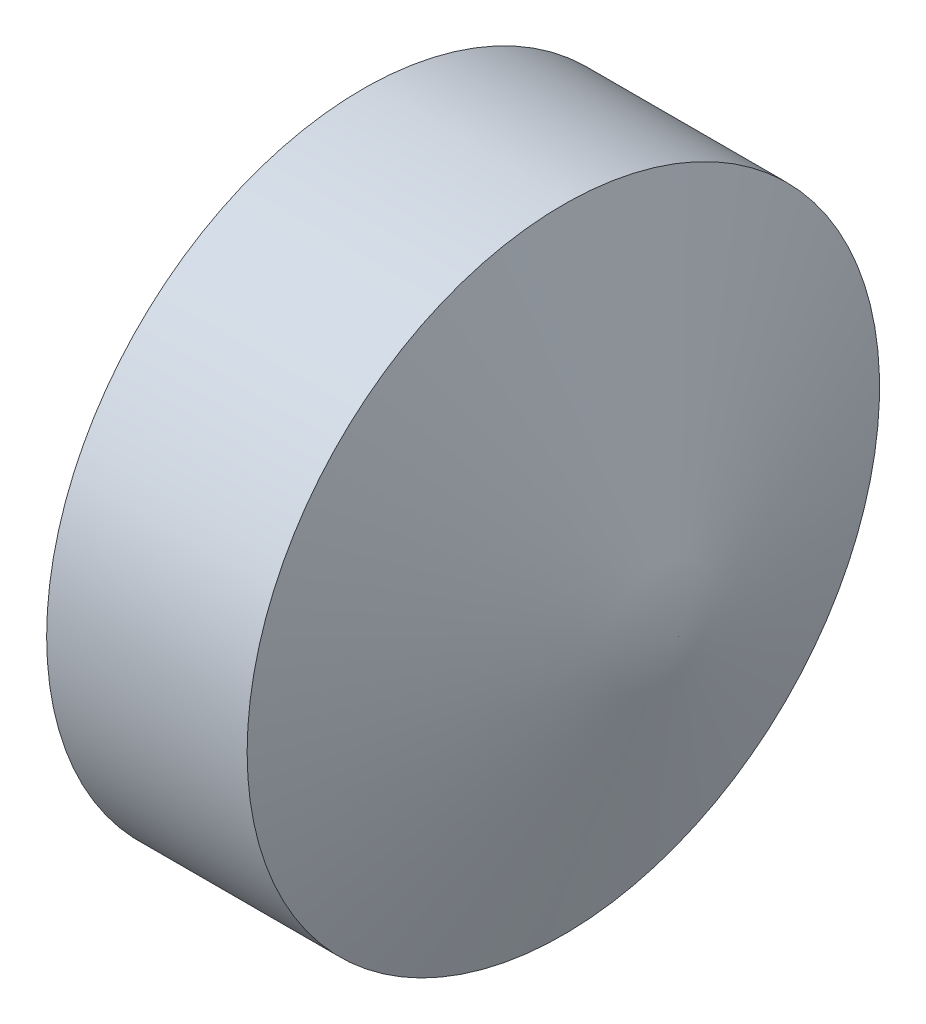
ISO-10303-21;
HEADER;
FILE_DESCRIPTION(('STEP AP214'),'2;1');
FILE_NAME('part.step','',(''),(''),'','','');
FILE_SCHEMA(('AUTOMOTIVE_DESIGN { 1 0 10303 214 1 1 1 1 }'));
ENDSEC;
DATA;
#1=APPLICATION_CONTEXT('core data for automotive mechanical design processes');
#2=APPLICATION_PROTOCOL_DEFINITION('international standard','automotive_design',2000,#1);
#3=PRODUCT_CONTEXT('',#1,'mechanical');
#4=PRODUCT('Part','Part','',(#3));
#5=PRODUCT_RELATED_PRODUCT_CATEGORY('part','',(#4));
#6=PRODUCT_DEFINITION_FORMATION('','',#4);
#7=PRODUCT_DEFINITION_CONTEXT('part definition',#1,'design');
#8=PRODUCT_DEFINITION('design','',#6,#7);
#9=PRODUCT_DEFINITION_SHAPE('','',#8);
#10=(LENGTH_UNIT() NAMED_UNIT(*) SI_UNIT(.MILLI.,.METRE.));
#11=(NAMED_UNIT(*) PLANE_ANGLE_UNIT() SI_UNIT($,.RADIAN.));
#12=(NAMED_UNIT(*) SI_UNIT($,.STERADIAN.) SOLID_ANGLE_UNIT());
#13=UNCERTAINTY_MEASURE_WITH_UNIT(LENGTH_MEASURE(1.E-05),#10,'distance_accuracy_value','');
#14=(GEOMETRIC_REPRESENTATION_CONTEXT(3) GLOBAL_UNCERTAINTY_ASSIGNED_CONTEXT((#13)) GLOBAL_UNIT_ASSIGNED_CONTEXT((#10,
#11,#12)) REPRESENTATION_CONTEXT('',''));
#15=CARTESIAN_POINT('',(0.,0.,0.));
#16=DIRECTION('',(0.,0.,1.));
#17=DIRECTION('',(1.,0.,0.));
#18=AXIS2_PLACEMENT_3D('',#15,#16,#17);
#19=CARTESIAN_POINT('',(3.,0.,0.));
#20=DIRECTION('',(-1.,0.,0.));
#21=DIRECTION('',(0.,0.,1.));
#22=AXIS2_PLACEMENT_3D('',#19,#20,#21);
#23=CYLINDRICAL_SURFACE('',#22,1.35632946891562);
#24=CARTESIAN_POINT('',(1.64635829323957,0.,0.));
#25=DIRECTION('',(-1.,0.,0.));
#26=DIRECTION('',(0.,0.,1.));
#27=AXIS2_PLACEMENT_3D('',#24,#25,#26);
#28=CIRCLE('',#27,1.35632946891562);
#29=CARTESIAN_POINT('',(1.64635829323957,0.,1.35632946891562));
#30=VERTEX_POINT('',#29);
#31=EDGE_CURVE('E11',#30,#30,#28,.F.);
#32=ORIENTED_EDGE('',*,*,#31,.T.);
#33=EDGE_LOOP('',(#32));
#34=FACE_BOUND('',#33,.T.);
#35=CARTESIAN_POINT('',(2.50633644545662,0.,0.));
#36=DIRECTION('',(-1.,0.,0.));
#37=DIRECTION('',(0.,0.,1.));
#38=AXIS2_PLACEMENT_3D('',#35,#36,#37);
#39=CIRCLE('',#38,1.35632946891562);
#40=CARTESIAN_POINT('',(2.50633644545662,0.,1.35632946891562));
#41=VERTEX_POINT('',#40);
#42=EDGE_CURVE('E137',#41,#41,#39,.T.);
#43=ORIENTED_EDGE('',*,*,#42,.T.);
#44=EDGE_LOOP('',(#43));
#45=FACE_BOUND('',#44,.T.);
#46=ADVANCED_FACE('F37',(#34,#45),#23,.T.);
#47=CARTESIAN_POINT('',(1.5,0.,0.));
#48=DIRECTION('',(-1.,0.,0.));
#49=DIRECTION('',(0.,0.,1.));
#50=AXIS2_PLACEMENT_3D('',#47,#48,#49);
#51=PLANE('',#50);
#52=CARTESIAN_POINT('',(1.5,0.,0.));
#53=DIRECTION('',(-1.,0.,0.));
#54=DIRECTION('',(0.,0.,1.));
#55=AXIS2_PLACEMENT_3D('',#52,#53,#54);
#56=CIRCLE('',#55,1.10282946891562);
#57=CARTESIAN_POINT('',(1.5,0.,1.10282946891562));
#58=VERTEX_POINT('',#57);
#59=EDGE_CURVE('E45',#58,#58,#56,.T.);
#60=ORIENTED_EDGE('',*,*,#59,.T.);
#61=EDGE_LOOP('',(#60));
#62=FACE_BOUND('',#61,.T.);
#63=DIRECTION('',(0.,0.,1.));
#64=VECTOR('',#63,1.);
#65=CARTESIAN_POINT('',(1.5,-0.65,-0.375277674973259));
#66=LINE('',#65,#64);
#67=CARTESIAN_POINT('',(1.5,-0.65,-0.375277674973259));
#68=VERTEX_POINT('',#67);
#69=CARTESIAN_POINT('',(1.5,-0.65,0.375277674973254));
#70=VERTEX_POINT('',#69);
#71=EDGE_CURVE('E52',#68,#70,#66,.T.);
#72=ORIENTED_EDGE('',*,*,#71,.F.);
#73=DIRECTION('',(0.,-0.866025403784439,0.499999999999999));
#74=VECTOR('',#73,1.);
#75=CARTESIAN_POINT('',(1.5,0.,-0.750555349946517));
#76=LINE('',#75,#74);
#77=CARTESIAN_POINT('',(1.5,0.,-0.750555349946517));
#78=VERTEX_POINT('',#77);
#79=EDGE_CURVE('E111',#78,#68,#76,.T.);
#80=ORIENTED_EDGE('',*,*,#79,.F.);
#81=DIRECTION('',(0.,-0.866025403784437,-0.500000000000002));
#82=VECTOR('',#81,1.);
#83=CARTESIAN_POINT('',(1.5,0.65,-0.37527767497326));
#84=LINE('',#83,#82);
#85=CARTESIAN_POINT('',(1.5,0.65,-0.37527767497326));
#86=VERTEX_POINT('',#85);
#87=EDGE_CURVE('E114',#86,#78,#84,.T.);
#88=ORIENTED_EDGE('',*,*,#87,.F.);
#89=DIRECTION('',(0.,0.,-1.));
#90=VECTOR('',#89,1.);
#91=CARTESIAN_POINT('',(1.5,0.65,0.375277674973253));
#92=LINE('',#91,#90);
#93=CARTESIAN_POINT('',(1.5,0.65,0.375277674973253));
#94=VERTEX_POINT('',#93);
#95=EDGE_CURVE('E130',#94,#86,#92,.T.);
#96=ORIENTED_EDGE('',*,*,#95,.F.);
#97=DIRECTION('',(0.,0.866025403784437,-0.500000000000002));
#98=VECTOR('',#97,1.);
#99=CARTESIAN_POINT('',(1.5,0.,0.75055534994651));
#100=LINE('',#99,#98);
#101=CARTESIAN_POINT('',(1.5,0.,0.75055534994651));
#102=VERTEX_POINT('',#101);
#103=EDGE_CURVE('E127',#102,#94,#100,.T.);
#104=ORIENTED_EDGE('',*,*,#103,.F.);
#105=DIRECTION('',(0.,0.86602540378444,0.499999999999997));
#106=VECTOR('',#105,1.);
#107=CARTESIAN_POINT('',(1.5,-0.65,0.375277674973254));
#108=LINE('',#107,#106);
#109=EDGE_CURVE('E125',#70,#102,#108,.T.);
#110=ORIENTED_EDGE('',*,*,#109,.F.);
#111=EDGE_LOOP('',(#72,#80,#88,#96,#104,#110));
#112=FACE_BOUND('',#111,.T.);
#113=ADVANCED_FACE('F149',(#62,#112),#51,.T.);
#114=CARTESIAN_POINT('',(2.50633644545662,0.,0.));
#115=DIRECTION('',(-1.,0.,0.));
#116=DIRECTION('',(0.,0.,1.));
#117=AXIS2_PLACEMENT_3D('',#114,#115,#116);
#118=CONICAL_SURFACE('',#117,1.35632946891562,1.22173047639603);
#119=CARTESIAN_POINT('',(3.,0.,0.));
#120=VERTEX_POINT('',#119);
#121=VERTEX_LOOP('',#120);
#122=FACE_BOUND('',#121,.T.);
#123=ORIENTED_EDGE('',*,*,#42,.F.);
#124=EDGE_LOOP('',(#123));
#125=FACE_BOUND('',#124,.T.);
#126=ADVANCED_FACE('F164',(#122,#125),#118,.T.);
#127=CARTESIAN_POINT('',(2.7,-0.65,-0.375277674973259));
#128=DIRECTION('',(0.,-1.,0.));
#129=DIRECTION('',(0.,0.,-1.));
#130=AXIS2_PLACEMENT_3D('',#127,#128,#129);
#131=PLANE('',#130);
#132=ORIENTED_EDGE('',*,*,#71,.T.);
#133=DIRECTION('',(-1.,0.,0.));
#134=VECTOR('',#133,1.);
#135=CARTESIAN_POINT('',(2.7,-0.65,0.375277674973254));
#136=LINE('',#135,#134);
#137=CARTESIAN_POINT('',(2.7,-0.65,0.375277674973254));
#138=VERTEX_POINT('',#137);
#139=EDGE_CURVE('E88',#138,#70,#136,.T.);
#140=ORIENTED_EDGE('',*,*,#139,.F.);
#141=DIRECTION('',(0.,0.,1.));
#142=VECTOR('',#141,1.);
#143=CARTESIAN_POINT('',(2.7,-0.65,-0.375277674973259));
#144=LINE('',#143,#142);
#145=CARTESIAN_POINT('',(2.7,-0.65,-0.375277674973259));
#146=VERTEX_POINT('',#145);
#147=EDGE_CURVE('E92',#146,#138,#144,.T.);
#148=ORIENTED_EDGE('',*,*,#147,.F.);
#149=DIRECTION('',(-1.,0.,0.));
#150=VECTOR('',#149,1.);
#151=CARTESIAN_POINT('',(2.7,-0.65,-0.375277674973259));
#152=LINE('',#151,#150);
#153=EDGE_CURVE('E135',#146,#68,#152,.T.);
#154=ORIENTED_EDGE('',*,*,#153,.T.);
#155=EDGE_LOOP('',(#132,#140,#148,#154));
#156=FACE_BOUND('',#155,.T.);
#157=ADVANCED_FACE('F90',(#156),#131,.F.);
#158=CARTESIAN_POINT('',(2.7,0.,-0.750555349946517));
#159=DIRECTION('',(0.,-0.499999999999999,-0.866025403784439));
#160=DIRECTION('',(0.,0.866025403784439,-0.499999999999999));
#161=AXIS2_PLACEMENT_3D('',#158,#159,#160);
#162=PLANE('',#161);
#163=ORIENTED_EDGE('',*,*,#79,.T.);
#164=ORIENTED_EDGE('',*,*,#153,.F.);
#165=DIRECTION('',(0.,-0.866025403784439,0.499999999999999));
#166=VECTOR('',#165,1.);
#167=CARTESIAN_POINT('',(2.7,0.,-0.750555349946517));
#168=LINE('',#167,#166);
#169=CARTESIAN_POINT('',(2.7,0.,-0.750555349946517));
#170=VERTEX_POINT('',#169);
#171=EDGE_CURVE('E98',#170,#146,#168,.T.);
#172=ORIENTED_EDGE('',*,*,#171,.F.);
#173=DIRECTION('',(-1.,0.,0.));
#174=VECTOR('',#173,1.);
#175=CARTESIAN_POINT('',(2.7,0.,-0.750555349946517));
#176=LINE('',#175,#174);
#177=EDGE_CURVE('E138',#170,#78,#176,.T.);
#178=ORIENTED_EDGE('',*,*,#177,.T.);
#179=EDGE_LOOP('',(#163,#164,#172,#178));
#180=FACE_BOUND('',#179,.T.);
#181=ADVANCED_FACE('F172',(#180),#162,.F.);
#182=CARTESIAN_POINT('',(2.7,0.65,-0.37527767497326));
#183=DIRECTION('',(0.,0.500000000000002,-0.866025403784437));
#184=DIRECTION('',(0.,0.866025403784437,0.500000000000002));
#185=AXIS2_PLACEMENT_3D('',#182,#183,#184);
#186=PLANE('',#185);
#187=ORIENTED_EDGE('',*,*,#87,.T.);
#188=ORIENTED_EDGE('',*,*,#177,.F.);
#189=DIRECTION('',(0.,-0.866025403784437,-0.500000000000002));
#190=VECTOR('',#189,1.);
#191=CARTESIAN_POINT('',(2.7,0.65,-0.37527767497326));
#192=LINE('',#191,#190);
#193=CARTESIAN_POINT('',(2.7,0.65,-0.37527767497326));
#194=VERTEX_POINT('',#193);
#195=EDGE_CURVE('E121',#194,#170,#192,.T.);
#196=ORIENTED_EDGE('',*,*,#195,.F.);
#197=DIRECTION('',(-1.,0.,0.));
#198=VECTOR('',#197,1.);
#199=CARTESIAN_POINT('',(2.7,0.65,-0.37527767497326));
#200=LINE('',#199,#198);
#201=EDGE_CURVE('E140',#194,#86,#200,.T.);
#202=ORIENTED_EDGE('',*,*,#201,.T.);
#203=EDGE_LOOP('',(#187,#188,#196,#202));
#204=FACE_BOUND('',#203,.T.);
#205=ADVANCED_FACE('F182',(#204),#186,.F.);
#206=CARTESIAN_POINT('',(2.7,0.65,0.375277674973253));
#207=DIRECTION('',(0.,1.,0.));
#208=DIRECTION('',(0.,0.,1.));
#209=AXIS2_PLACEMENT_3D('',#206,#207,#208);
#210=PLANE('',#209);
#211=ORIENTED_EDGE('',*,*,#95,.T.);
#212=ORIENTED_EDGE('',*,*,#201,.F.);
#213=DIRECTION('',(0.,0.,-1.));
#214=VECTOR('',#213,1.);
#215=CARTESIAN_POINT('',(2.7,0.65,0.375277674973253));
#216=LINE('',#215,#214);
#217=CARTESIAN_POINT('',(2.7,0.65,0.375277674973253));
#218=VERTEX_POINT('',#217);
#219=EDGE_CURVE('E118',#218,#194,#216,.T.);
#220=ORIENTED_EDGE('',*,*,#219,.F.);
#221=DIRECTION('',(-1.,0.,0.));
#222=VECTOR('',#221,1.);
#223=CARTESIAN_POINT('',(2.7,0.65,0.375277674973253));
#224=LINE('',#223,#222);
#225=EDGE_CURVE('E142',#218,#94,#224,.T.);
#226=ORIENTED_EDGE('',*,*,#225,.T.);
#227=EDGE_LOOP('',(#211,#212,#220,#226));
#228=FACE_BOUND('',#227,.T.);
#229=ADVANCED_FACE('F178',(#228),#210,.F.);
#230=CARTESIAN_POINT('',(2.7,0.,0.75055534994651));
#231=DIRECTION('',(0.,0.500000000000002,0.866025403784437));
#232=DIRECTION('',(0.,-0.866025403784438,0.500000000000002));
#233=AXIS2_PLACEMENT_3D('',#230,#231,#232);
#234=PLANE('',#233);
#235=ORIENTED_EDGE('',*,*,#103,.T.);
#236=ORIENTED_EDGE('',*,*,#225,.F.);
#237=DIRECTION('',(0.,0.866025403784437,-0.500000000000002));
#238=VECTOR('',#237,1.);
#239=CARTESIAN_POINT('',(2.7,0.,0.75055534994651));
#240=LINE('',#239,#238);
#241=CARTESIAN_POINT('',(2.7,0.,0.75055534994651));
#242=VERTEX_POINT('',#241);
#243=EDGE_CURVE('E106',#242,#218,#240,.T.);
#244=ORIENTED_EDGE('',*,*,#243,.F.);
#245=DIRECTION('',(-1.,0.,0.));
#246=VECTOR('',#245,1.);
#247=CARTESIAN_POINT('',(2.7,0.,0.75055534994651));
#248=LINE('',#247,#246);
#249=EDGE_CURVE('E97',#242,#102,#248,.T.);
#250=ORIENTED_EDGE('',*,*,#249,.T.);
#251=EDGE_LOOP('',(#235,#236,#244,#250));
#252=FACE_BOUND('',#251,.T.);
#253=ADVANCED_FACE('F175',(#252),#234,.F.);
#254=CARTESIAN_POINT('',(2.7,-0.65,0.375277674973254));
#255=DIRECTION('',(0.,-0.499999999999997,0.86602540378444));
#256=DIRECTION('',(0.,-0.86602540378444,-0.499999999999997));
#257=AXIS2_PLACEMENT_3D('',#254,#255,#256);
#258=PLANE('',#257);
#259=ORIENTED_EDGE('',*,*,#109,.T.);
#260=ORIENTED_EDGE('',*,*,#249,.F.);
#261=DIRECTION('',(0.,0.86602540378444,0.499999999999997));
#262=VECTOR('',#261,1.);
#263=CARTESIAN_POINT('',(2.7,-0.65,0.375277674973254));
#264=LINE('',#263,#262);
#265=EDGE_CURVE('E101',#138,#242,#264,.T.);
#266=ORIENTED_EDGE('',*,*,#265,.F.);
#267=ORIENTED_EDGE('',*,*,#139,.T.);
#268=EDGE_LOOP('',(#259,#260,#266,#267));
#269=FACE_BOUND('',#268,.T.);
#270=ADVANCED_FACE('F102',(#269),#258,.F.);
#271=CARTESIAN_POINT('',(2.7,0.,0.));
#272=DIRECTION('',(-1.,0.,0.));
#273=DIRECTION('',(0.,0.,1.));
#274=AXIS2_PLACEMENT_3D('',#271,#272,#273);
#275=PLANE('',#274);
#276=ORIENTED_EDGE('',*,*,#147,.T.);
#277=ORIENTED_EDGE('',*,*,#265,.T.);
#278=ORIENTED_EDGE('',*,*,#243,.T.);
#279=ORIENTED_EDGE('',*,*,#219,.T.);
#280=ORIENTED_EDGE('',*,*,#195,.T.);
#281=ORIENTED_EDGE('',*,*,#171,.T.);
#282=EDGE_LOOP('',(#276,#277,#278,#279,#280,#281));
#283=FACE_BOUND('',#282,.T.);
#284=ADVANCED_FACE('F108',(#283),#275,.T.);
#285=CARTESIAN_POINT('',(1.5,0.,0.));
#286=DIRECTION('',(1.,0.,0.));
#287=DIRECTION('',(0.,0.,-1.));
#288=AXIS2_PLACEMENT_3D('',#285,#286,#287);
#289=CONICAL_SURFACE('',#288,1.10282946891562,1.0471975511966);
#290=ORIENTED_EDGE('',*,*,#31,.F.);
#291=EDGE_LOOP('',(#290));
#292=FACE_BOUND('',#291,.T.);
#293=ORIENTED_EDGE('',*,*,#59,.F.);
#294=EDGE_LOOP('',(#293));
#295=FACE_BOUND('',#294,.T.);
#296=ADVANCED_FACE('F39',(#292,#295),#289,.T.);
#297=CLOSED_SHELL('',(#46,#113,#126,#157,#181,#205,#229,#253,#270,#284,#296));
#298=MANIFOLD_SOLID_BREP('B2',#297);
#299=ADVANCED_BREP_SHAPE_REPRESENTATION('',(#18,#298),#14);
#300=SHAPE_DEFINITION_REPRESENTATION(#9,#299);
ENDSEC;
END-ISO-10303-21;
